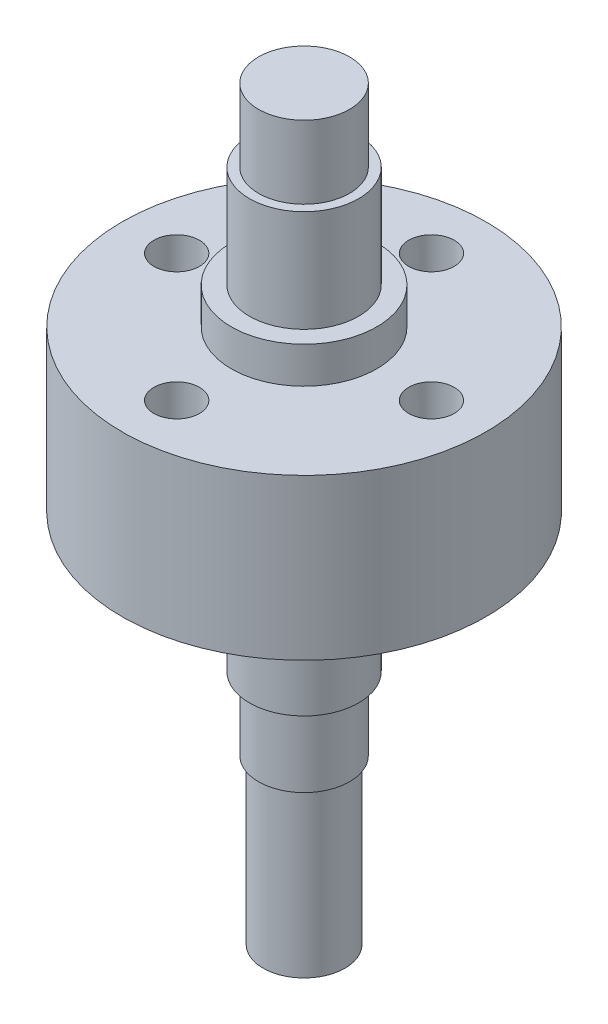
ISO-10303-21;
HEADER;
FILE_DESCRIPTION(('STEP AP214'),'2;1');
FILE_NAME('part.step','',(''),(''),'','','');
FILE_SCHEMA(('AUTOMOTIVE_DESIGN { 1 0 10303 214 1 1 1 1 }'));
ENDSEC;
DATA;
#1=APPLICATION_CONTEXT('core data for automotive mechanical design processes');
#2=APPLICATION_PROTOCOL_DEFINITION('international standard','automotive_design',2000,#1);
#3=PRODUCT_CONTEXT('',#1,'mechanical');
#4=PRODUCT('Part','Part','',(#3));
#5=PRODUCT_RELATED_PRODUCT_CATEGORY('part','',(#4));
#6=PRODUCT_DEFINITION_FORMATION('','',#4);
#7=PRODUCT_DEFINITION_CONTEXT('part definition',#1,'design');
#8=PRODUCT_DEFINITION('design','',#6,#7);
#9=PRODUCT_DEFINITION_SHAPE('','',#8);
#10=(LENGTH_UNIT() NAMED_UNIT(*) SI_UNIT(.MILLI.,.METRE.));
#11=(NAMED_UNIT(*) PLANE_ANGLE_UNIT() SI_UNIT($,.RADIAN.));
#12=(NAMED_UNIT(*) SI_UNIT($,.STERADIAN.) SOLID_ANGLE_UNIT());
#13=UNCERTAINTY_MEASURE_WITH_UNIT(LENGTH_MEASURE(1.E-05),#10,'distance_accuracy_value','');
#14=(GEOMETRIC_REPRESENTATION_CONTEXT(3) GLOBAL_UNCERTAINTY_ASSIGNED_CONTEXT((#13)) GLOBAL_UNIT_ASSIGNED_CONTEXT((#10,
#11,#12)) REPRESENTATION_CONTEXT('',''));
#15=CARTESIAN_POINT('',(0.,0.,0.));
#16=DIRECTION('',(0.,0.,1.));
#17=DIRECTION('',(1.,0.,0.));
#18=AXIS2_PLACEMENT_3D('',#15,#16,#17);
#19=CARTESIAN_POINT('',(3.99999999990086,11.6000000000056,0.));
#20=DIRECTION('',(0.,1.,0.));
#21=DIRECTION('',(-1.,0.,0.));
#22=AXIS2_PLACEMENT_3D('',#19,#20,#21);
#23=PLANE('',#22);
#24=CARTESIAN_POINT('',(-7.00000000000001,11.6000000000056,0.));
#25=DIRECTION('',(0.,-1.,0.));
#26=DIRECTION('',(0.,0.,-1.));
#27=AXIS2_PLACEMENT_3D('',#24,#25,#26);
#28=CIRCLE('',#27,1.25);
#29=CARTESIAN_POINT('',(-7.00000000000001,11.6000000000056,-1.24999999999993));
#30=VERTEX_POINT('',#29);
#31=EDGE_CURVE('E85',#30,#30,#28,.T.);
#32=ORIENTED_EDGE('',*,*,#31,.F.);
#33=EDGE_LOOP('',(#32));
#34=FACE_BOUND('',#33,.T.);
#35=CARTESIAN_POINT('',(0.,11.6000000000056,-7.));
#36=DIRECTION('',(0.,-1.,0.));
#37=DIRECTION('',(0.,0.,-1.));
#38=AXIS2_PLACEMENT_3D('',#35,#36,#37);
#39=CIRCLE('',#38,1.25);
#40=CARTESIAN_POINT('',(0.,11.6000000000056,-8.25));
#41=VERTEX_POINT('',#40);
#42=EDGE_CURVE('E93',#41,#41,#39,.T.);
#43=ORIENTED_EDGE('',*,*,#42,.F.);
#44=EDGE_LOOP('',(#43));
#45=FACE_BOUND('',#44,.T.);
#46=CARTESIAN_POINT('',(6.99999999999999,11.6000000000056,0.));
#47=DIRECTION('',(0.,-1.,0.));
#48=DIRECTION('',(0.,0.,-1.));
#49=AXIS2_PLACEMENT_3D('',#46,#47,#48);
#50=CIRCLE('',#49,1.25);
#51=CARTESIAN_POINT('',(6.99999999999999,11.6000000000056,-1.25000000000002));
#52=VERTEX_POINT('',#51);
#53=EDGE_CURVE('E101',#52,#52,#50,.T.);
#54=ORIENTED_EDGE('',*,*,#53,.F.);
#55=EDGE_LOOP('',(#54));
#56=FACE_BOUND('',#55,.T.);
#57=CARTESIAN_POINT('',(0.,11.6000000000056,7.));
#58=DIRECTION('',(0.,-1.,0.));
#59=DIRECTION('',(0.,0.,-1.));
#60=AXIS2_PLACEMENT_3D('',#57,#58,#59);
#61=CIRCLE('',#60,1.25);
#62=CARTESIAN_POINT('',(0.,11.6000000000056,5.75));
#63=VERTEX_POINT('',#62);
#64=EDGE_CURVE('E109',#63,#63,#61,.T.);
#65=ORIENTED_EDGE('',*,*,#64,.F.);
#66=EDGE_LOOP('',(#65));
#67=FACE_BOUND('',#66,.T.);
#68=CARTESIAN_POINT('',(0.,11.6000000000056,0.));
#69=DIRECTION('',(0.,1.,0.));
#70=DIRECTION('',(-1.,0.,0.));
#71=AXIS2_PLACEMENT_3D('',#68,#69,#70);
#72=CIRCLE('',#71,10.0000000000245);
#73=CARTESIAN_POINT('',(-10.0000000000246,11.6000000000056,0.));
#74=VERTEX_POINT('',#73);
#75=EDGE_CURVE('E63',#74,#74,#72,.T.);
#76=ORIENTED_EDGE('',*,*,#75,.F.);
#77=EDGE_LOOP('',(#76));
#78=FACE_BOUND('',#77,.T.);
#79=CARTESIAN_POINT('',(0.,11.6000000000056,0.));
#80=DIRECTION('',(0.,1.,0.));
#81=DIRECTION('',(-1.,0.,0.));
#82=AXIS2_PLACEMENT_3D('',#79,#80,#81);
#83=CIRCLE('',#82,3.99999999990086);
#84=CARTESIAN_POINT('',(-3.99999999990087,11.6000000000056,0.));
#85=VERTEX_POINT('',#84);
#86=EDGE_CURVE('E117',#85,#85,#83,.T.);
#87=ORIENTED_EDGE('',*,*,#86,.T.);
#88=EDGE_LOOP('',(#87));
#89=FACE_BOUND('',#88,.T.);
#90=ADVANCED_FACE('F55',(#34,#45,#56,#67,#78,#89),#23,.F.);
#91=CARTESIAN_POINT('',(0.,32.0000000000004,0.));
#92=DIRECTION('',(0.,1.,0.));
#93=DIRECTION('',(-1.,0.,0.));
#94=AXIS2_PLACEMENT_3D('',#91,#92,#93);
#95=CYLINDRICAL_SURFACE('',#94,10.0000000000246);
#96=CARTESIAN_POINT('',(0.,20.3999999999455,0.));
#97=DIRECTION('',(0.,1.,0.));
#98=DIRECTION('',(-1.,0.,0.));
#99=AXIS2_PLACEMENT_3D('',#96,#97,#98);
#100=CIRCLE('',#99,10.0000000000246);
#101=CARTESIAN_POINT('',(-10.0000000000246,20.3999999999455,0.));
#102=VERTEX_POINT('',#101);
#103=EDGE_CURVE('E165',#102,#102,#100,.T.);
#104=ORIENTED_EDGE('',*,*,#103,.F.);
#105=EDGE_LOOP('',(#104));
#106=FACE_BOUND('',#105,.T.);
#107=ORIENTED_EDGE('',*,*,#75,.T.);
#108=EDGE_LOOP('',(#107));
#109=FACE_BOUND('',#108,.T.);
#110=ADVANCED_FACE('F173',(#106,#109),#95,.T.);
#111=CARTESIAN_POINT('',(4.00000000001181,20.3999999999455,0.));
#112=DIRECTION('',(0.,-1.,0.));
#113=DIRECTION('',(1.,0.,0.));
#114=AXIS2_PLACEMENT_3D('',#111,#112,#113);
#115=PLANE('',#114);
#116=CARTESIAN_POINT('',(-7.00000000000001,20.3999999999455,0.));
#117=DIRECTION('',(0.,-1.,0.));
#118=DIRECTION('',(1.,0.,0.));
#119=AXIS2_PLACEMENT_3D('',#116,#117,#118);
#120=CIRCLE('',#119,1.25);
#121=CARTESIAN_POINT('',(-5.75000000000001,20.3999999999455,0.));
#122=VERTEX_POINT('',#121);
#123=EDGE_CURVE('E58',#122,#122,#120,.T.);
#124=ORIENTED_EDGE('',*,*,#123,.T.);
#125=EDGE_LOOP('',(#124));
#126=FACE_BOUND('',#125,.T.);
#127=CARTESIAN_POINT('',(0.,20.3999999999455,-7.));
#128=DIRECTION('',(0.,-1.,0.));
#129=DIRECTION('',(1.,0.,0.));
#130=AXIS2_PLACEMENT_3D('',#127,#128,#129);
#131=CIRCLE('',#130,1.25);
#132=CARTESIAN_POINT('',(1.24999999999999,20.3999999999455,-7.));
#133=VERTEX_POINT('',#132);
#134=EDGE_CURVE('E97',#133,#133,#131,.T.);
#135=ORIENTED_EDGE('',*,*,#134,.T.);
#136=EDGE_LOOP('',(#135));
#137=FACE_BOUND('',#136,.T.);
#138=CARTESIAN_POINT('',(6.99999999999999,20.3999999999455,0.));
#139=DIRECTION('',(0.,-1.,0.));
#140=DIRECTION('',(1.,0.,0.));
#141=AXIS2_PLACEMENT_3D('',#138,#139,#140);
#142=CIRCLE('',#141,1.25);
#143=CARTESIAN_POINT('',(8.24999999999999,20.3999999999455,0.));
#144=VERTEX_POINT('',#143);
#145=EDGE_CURVE('E105',#144,#144,#142,.T.);
#146=ORIENTED_EDGE('',*,*,#145,.T.);
#147=EDGE_LOOP('',(#146));
#148=FACE_BOUND('',#147,.T.);
#149=CARTESIAN_POINT('',(0.,20.3999999999455,7.));
#150=DIRECTION('',(0.,-1.,0.));
#151=DIRECTION('',(1.,0.,0.));
#152=AXIS2_PLACEMENT_3D('',#149,#150,#151);
#153=CIRCLE('',#152,1.25);
#154=CARTESIAN_POINT('',(1.24999999999999,20.3999999999455,7.));
#155=VERTEX_POINT('',#154);
#156=EDGE_CURVE('E113',#155,#155,#153,.T.);
#157=ORIENTED_EDGE('',*,*,#156,.T.);
#158=EDGE_LOOP('',(#157));
#159=FACE_BOUND('',#158,.T.);
#160=CARTESIAN_POINT('',(0.,20.3999999999455,0.));
#161=DIRECTION('',(0.,1.,0.));
#162=DIRECTION('',(-1.,0.,0.));
#163=AXIS2_PLACEMENT_3D('',#160,#161,#162);
#164=CIRCLE('',#163,4.00000000001182);
#165=CARTESIAN_POINT('',(-4.00000000001183,20.3999999999455,0.));
#166=VERTEX_POINT('',#165);
#167=EDGE_CURVE('E161',#166,#166,#164,.T.);
#168=ORIENTED_EDGE('',*,*,#167,.F.);
#169=EDGE_LOOP('',(#168));
#170=FACE_BOUND('',#169,.T.);
#171=ORIENTED_EDGE('',*,*,#103,.T.);
#172=EDGE_LOOP('',(#171));
#173=FACE_BOUND('',#172,.T.);
#174=ADVANCED_FACE('F242',(#126,#137,#148,#159,#170,#173),#115,.F.);
#175=CARTESIAN_POINT('',(0.,32.0000000000004,0.));
#176=DIRECTION('',(0.,1.,0.));
#177=DIRECTION('',(-1.,0.,0.));
#178=AXIS2_PLACEMENT_3D('',#175,#176,#177);
#179=CYLINDRICAL_SURFACE('',#178,4.00000000001182);
#180=CARTESIAN_POINT('',(0.,22.3999999999395,0.));
#181=DIRECTION('',(0.,1.,0.));
#182=DIRECTION('',(-1.,0.,0.));
#183=AXIS2_PLACEMENT_3D('',#180,#181,#182);
#184=CIRCLE('',#183,4.00000000001182);
#185=CARTESIAN_POINT('',(-4.00000000001183,22.3999999999395,0.));
#186=VERTEX_POINT('',#185);
#187=EDGE_CURVE('E157',#186,#186,#184,.T.);
#188=ORIENTED_EDGE('',*,*,#187,.F.);
#189=EDGE_LOOP('',(#188));
#190=FACE_BOUND('',#189,.T.);
#191=ORIENTED_EDGE('',*,*,#167,.T.);
#192=EDGE_LOOP('',(#191));
#193=FACE_BOUND('',#192,.T.);
#194=ADVANCED_FACE('F238',(#190,#193),#179,.T.);
#195=CARTESIAN_POINT('',(3.00000000000999,22.3999999999395,0.));
#196=DIRECTION('',(0.,-1.,0.));
#197=DIRECTION('',(1.,0.,0.));
#198=AXIS2_PLACEMENT_3D('',#195,#196,#197);
#199=PLANE('',#198);
#200=CARTESIAN_POINT('',(0.,22.3999999999395,0.));
#201=DIRECTION('',(0.,1.,0.));
#202=DIRECTION('',(-1.,0.,0.));
#203=AXIS2_PLACEMENT_3D('',#200,#201,#202);
#204=CIRCLE('',#203,3.00000000001);
#205=CARTESIAN_POINT('',(-3.00000000001001,22.3999999999395,0.));
#206=VERTEX_POINT('',#205);
#207=EDGE_CURVE('E153',#206,#206,#204,.T.);
#208=ORIENTED_EDGE('',*,*,#207,.F.);
#209=EDGE_LOOP('',(#208));
#210=FACE_BOUND('',#209,.T.);
#211=ORIENTED_EDGE('',*,*,#187,.T.);
#212=EDGE_LOOP('',(#211));
#213=FACE_BOUND('',#212,.T.);
#214=ADVANCED_FACE('F234',(#210,#213),#199,.F.);
#215=CARTESIAN_POINT('',(0.,32.0000000000004,0.));
#216=DIRECTION('',(0.,1.,0.));
#217=DIRECTION('',(-1.,0.,0.));
#218=AXIS2_PLACEMENT_3D('',#215,#216,#217);
#219=CYLINDRICAL_SURFACE('',#218,3.00000000001);
#220=CARTESIAN_POINT('',(0.,27.9999999999995,0.));
#221=DIRECTION('',(0.,1.,0.));
#222=DIRECTION('',(-1.,0.,0.));
#223=AXIS2_PLACEMENT_3D('',#220,#221,#222);
#224=CIRCLE('',#223,3.00000000001);
#225=CARTESIAN_POINT('',(-3.00000000001002,27.9999999999995,0.));
#226=VERTEX_POINT('',#225);
#227=EDGE_CURVE('E149',#226,#226,#224,.T.);
#228=ORIENTED_EDGE('',*,*,#227,.F.);
#229=EDGE_LOOP('',(#228));
#230=FACE_BOUND('',#229,.T.);
#231=ORIENTED_EDGE('',*,*,#207,.T.);
#232=EDGE_LOOP('',(#231));
#233=FACE_BOUND('',#232,.T.);
#234=ADVANCED_FACE('F230',(#230,#233),#219,.T.);
#235=CARTESIAN_POINT('',(2.50000000000272,27.9999999999995,0.));
#236=DIRECTION('',(0.,-1.,0.));
#237=DIRECTION('',(1.,0.,0.));
#238=AXIS2_PLACEMENT_3D('',#235,#236,#237);
#239=PLANE('',#238);
#240=CARTESIAN_POINT('',(0.,27.9999999999995,0.));
#241=DIRECTION('',(0.,1.,0.));
#242=DIRECTION('',(-1.,0.,0.));
#243=AXIS2_PLACEMENT_3D('',#240,#241,#242);
#244=CIRCLE('',#243,2.50000000000273);
#245=CARTESIAN_POINT('',(-2.50000000000274,27.9999999999995,0.));
#246=VERTEX_POINT('',#245);
#247=EDGE_CURVE('E145',#246,#246,#244,.T.);
#248=ORIENTED_EDGE('',*,*,#247,.F.);
#249=EDGE_LOOP('',(#248));
#250=FACE_BOUND('',#249,.T.);
#251=ORIENTED_EDGE('',*,*,#227,.T.);
#252=EDGE_LOOP('',(#251));
#253=FACE_BOUND('',#252,.T.);
#254=ADVANCED_FACE('F226',(#250,#253),#239,.F.);
#255=CARTESIAN_POINT('',(0.,32.0000000000004,0.));
#256=DIRECTION('',(0.,1.,0.));
#257=DIRECTION('',(-1.,0.,0.));
#258=AXIS2_PLACEMENT_3D('',#255,#256,#257);
#259=CYLINDRICAL_SURFACE('',#258,2.50000000000273);
#260=CARTESIAN_POINT('',(0.,32.0000000000004,0.));
#261=DIRECTION('',(0.,1.,0.));
#262=DIRECTION('',(-1.,0.,0.));
#263=AXIS2_PLACEMENT_3D('',#260,#261,#262);
#264=CIRCLE('',#263,2.50000000000273);
#265=CARTESIAN_POINT('',(-2.50000000000274,32.0000000000004,0.));
#266=VERTEX_POINT('',#265);
#267=EDGE_CURVE('E141',#266,#266,#264,.T.);
#268=ORIENTED_EDGE('',*,*,#267,.F.);
#269=EDGE_LOOP('',(#268));
#270=FACE_BOUND('',#269,.T.);
#271=ORIENTED_EDGE('',*,*,#247,.T.);
#272=EDGE_LOOP('',(#271));
#273=FACE_BOUND('',#272,.T.);
#274=ADVANCED_FACE('F219',(#270,#273),#259,.T.);
#275=CARTESIAN_POINT('',(0.,32.0000000000004,0.));
#276=DIRECTION('',(0.,-1.,0.));
#277=DIRECTION('',(1.,0.,0.));
#278=AXIS2_PLACEMENT_3D('',#275,#276,#277);
#279=PLANE('',#278);
#280=ORIENTED_EDGE('',*,*,#267,.T.);
#281=EDGE_LOOP('',(#280));
#282=FACE_BOUND('',#281,.T.);
#283=ADVANCED_FACE('F213',(#282),#279,.F.);
#284=CARTESIAN_POINT('',(0.,0.,0.));
#285=DIRECTION('',(0.,1.,0.));
#286=DIRECTION('',(-1.,0.,0.));
#287=AXIS2_PLACEMENT_3D('',#284,#285,#286);
#288=PLANE('',#287);
#289=CARTESIAN_POINT('',(0.,0.,0.));
#290=DIRECTION('',(0.,-1.,0.));
#291=DIRECTION('',(1.,0.,0.));
#292=AXIS2_PLACEMENT_3D('',#289,#290,#291);
#293=CIRCLE('',#292,2.25);
#294=CARTESIAN_POINT('',(2.25,0.,0.));
#295=VERTEX_POINT('',#294);
#296=EDGE_CURVE('E11',#295,#295,#293,.T.);
#297=ORIENTED_EDGE('',*,*,#296,.F.);
#298=EDGE_LOOP('',(#297));
#299=FACE_BOUND('',#298,.T.);
#300=CARTESIAN_POINT('',(0.,0.,0.));
#301=DIRECTION('',(0.,1.,0.));
#302=DIRECTION('',(-1.,0.,0.));
#303=AXIS2_PLACEMENT_3D('',#300,#301,#302);
#304=CIRCLE('',#303,2.50000000003182);
#305=CARTESIAN_POINT('',(-2.50000000003182,0.,0.));
#306=VERTEX_POINT('',#305);
#307=EDGE_CURVE('E137',#306,#306,#304,.T.);
#308=ORIENTED_EDGE('',*,*,#307,.F.);
#309=EDGE_LOOP('',(#308));
#310=FACE_BOUND('',#309,.T.);
#311=ADVANCED_FACE('F208',(#299,#310),#288,.F.);
#312=CARTESIAN_POINT('',(0.,32.0000000000004,0.));
#313=DIRECTION('',(0.,1.,0.));
#314=DIRECTION('',(-1.,0.,0.));
#315=AXIS2_PLACEMENT_3D('',#312,#313,#314);
#316=CYLINDRICAL_SURFACE('',#315,2.50000000003182);
#317=CARTESIAN_POINT('',(0.,4.,0.));
#318=DIRECTION('',(0.,1.,0.));
#319=DIRECTION('',(-1.,0.,0.));
#320=AXIS2_PLACEMENT_3D('',#317,#318,#319);
#321=CIRCLE('',#320,2.50000000003182);
#322=CARTESIAN_POINT('',(-2.50000000003183,4.,0.));
#323=VERTEX_POINT('',#322);
#324=EDGE_CURVE('E133',#323,#323,#321,.T.);
#325=ORIENTED_EDGE('',*,*,#324,.F.);
#326=EDGE_LOOP('',(#325));
#327=FACE_BOUND('',#326,.T.);
#328=ORIENTED_EDGE('',*,*,#307,.T.);
#329=EDGE_LOOP('',(#328));
#330=FACE_BOUND('',#329,.T.);
#331=ADVANCED_FACE('F202',(#327,#330),#316,.T.);
#332=CARTESIAN_POINT('',(2.50000000003182,4.,0.));
#333=DIRECTION('',(0.,1.,0.));
#334=DIRECTION('',(-1.,0.,0.));
#335=AXIS2_PLACEMENT_3D('',#332,#333,#334);
#336=PLANE('',#335);
#337=CARTESIAN_POINT('',(0.,4.,0.));
#338=DIRECTION('',(0.,1.,0.));
#339=DIRECTION('',(-1.,0.,0.));
#340=AXIS2_PLACEMENT_3D('',#337,#338,#339);
#341=CIRCLE('',#340,3.00000000002455);
#342=CARTESIAN_POINT('',(-3.00000000002455,3.99999999999999,0.));
#343=VERTEX_POINT('',#342);
#344=EDGE_CURVE('E129',#343,#343,#341,.T.);
#345=ORIENTED_EDGE('',*,*,#344,.F.);
#346=EDGE_LOOP('',(#345));
#347=FACE_BOUND('',#346,.T.);
#348=ORIENTED_EDGE('',*,*,#324,.T.);
#349=EDGE_LOOP('',(#348));
#350=FACE_BOUND('',#349,.T.);
#351=ADVANCED_FACE('F196',(#347,#350),#336,.F.);
#352=CARTESIAN_POINT('',(0.,32.0000000000004,0.));
#353=DIRECTION('',(0.,1.,0.));
#354=DIRECTION('',(-1.,0.,0.));
#355=AXIS2_PLACEMENT_3D('',#352,#353,#354);
#356=CYLINDRICAL_SURFACE('',#355,3.00000000002455);
#357=CARTESIAN_POINT('',(0.,9.60000000001014,0.));
#358=DIRECTION('',(0.,1.,0.));
#359=DIRECTION('',(-1.,0.,0.));
#360=AXIS2_PLACEMENT_3D('',#357,#358,#359);
#361=CIRCLE('',#360,3.00000000002456);
#362=CARTESIAN_POINT('',(-3.00000000002456,9.60000000001014,0.));
#363=VERTEX_POINT('',#362);
#364=EDGE_CURVE('E125',#363,#363,#361,.T.);
#365=ORIENTED_EDGE('',*,*,#364,.F.);
#366=EDGE_LOOP('',(#365));
#367=FACE_BOUND('',#366,.T.);
#368=ORIENTED_EDGE('',*,*,#344,.T.);
#369=EDGE_LOOP('',(#368));
#370=FACE_BOUND('',#369,.T.);
#371=ADVANCED_FACE('F190',(#367,#370),#356,.T.);
#372=CARTESIAN_POINT('',(3.00000000002455,9.60000000001014,0.));
#373=DIRECTION('',(0.,1.,0.));
#374=DIRECTION('',(-1.,0.,0.));
#375=AXIS2_PLACEMENT_3D('',#372,#373,#374);
#376=PLANE('',#375);
#377=CARTESIAN_POINT('',(0.,9.60000000001014,0.));
#378=DIRECTION('',(0.,1.,0.));
#379=DIRECTION('',(-1.,0.,0.));
#380=AXIS2_PLACEMENT_3D('',#377,#378,#379);
#381=CIRCLE('',#380,3.99999999990086);
#382=CARTESIAN_POINT('',(-3.99999999990087,9.60000000001013,0.));
#383=VERTEX_POINT('',#382);
#384=EDGE_CURVE('E121',#383,#383,#381,.T.);
#385=ORIENTED_EDGE('',*,*,#384,.F.);
#386=EDGE_LOOP('',(#385));
#387=FACE_BOUND('',#386,.T.);
#388=ORIENTED_EDGE('',*,*,#364,.T.);
#389=EDGE_LOOP('',(#388));
#390=FACE_BOUND('',#389,.T.);
#391=ADVANCED_FACE('F184',(#387,#390),#376,.F.);
#392=CARTESIAN_POINT('',(0.,32.0000000000004,0.));
#393=DIRECTION('',(0.,1.,0.));
#394=DIRECTION('',(-1.,0.,0.));
#395=AXIS2_PLACEMENT_3D('',#392,#393,#394);
#396=CYLINDRICAL_SURFACE('',#395,3.99999999990086);
#397=ORIENTED_EDGE('',*,*,#86,.F.);
#398=EDGE_LOOP('',(#397));
#399=FACE_BOUND('',#398,.T.);
#400=ORIENTED_EDGE('',*,*,#384,.T.);
#401=EDGE_LOOP('',(#400));
#402=FACE_BOUND('',#401,.T.);
#403=ADVANCED_FACE('F180',(#399,#402),#396,.T.);
#404=CARTESIAN_POINT('',(0.,11.6000000000056,7.));
#405=DIRECTION('',(0.,-1.,0.));
#406=DIRECTION('',(0.,0.,-1.));
#407=AXIS2_PLACEMENT_3D('',#404,#405,#406);
#408=CYLINDRICAL_SURFACE('',#407,1.25);
#409=ORIENTED_EDGE('',*,*,#64,.T.);
#410=EDGE_LOOP('',(#409));
#411=FACE_BOUND('',#410,.T.);
#412=ORIENTED_EDGE('',*,*,#156,.F.);
#413=EDGE_LOOP('',(#412));
#414=FACE_BOUND('',#413,.T.);
#415=ADVANCED_FACE('F183',(#411,#414),#408,.F.);
#416=CARTESIAN_POINT('',(6.99999999999999,11.6000000000056,0.));
#417=DIRECTION('',(0.,-1.,0.));
#418=DIRECTION('',(0.,0.,-1.));
#419=AXIS2_PLACEMENT_3D('',#416,#417,#418);
#420=CYLINDRICAL_SURFACE('',#419,1.25);
#421=ORIENTED_EDGE('',*,*,#53,.T.);
#422=EDGE_LOOP('',(#421));
#423=FACE_BOUND('',#422,.T.);
#424=ORIENTED_EDGE('',*,*,#145,.F.);
#425=EDGE_LOOP('',(#424));
#426=FACE_BOUND('',#425,.T.);
#427=ADVANCED_FACE('F314',(#423,#426),#420,.F.);
#428=CARTESIAN_POINT('',(0.,11.6000000000056,-7.));
#429=DIRECTION('',(0.,-1.,0.));
#430=DIRECTION('',(0.,0.,-1.));
#431=AXIS2_PLACEMENT_3D('',#428,#429,#430);
#432=CYLINDRICAL_SURFACE('',#431,1.25);
#433=ORIENTED_EDGE('',*,*,#42,.T.);
#434=EDGE_LOOP('',(#433));
#435=FACE_BOUND('',#434,.T.);
#436=ORIENTED_EDGE('',*,*,#134,.F.);
#437=EDGE_LOOP('',(#436));
#438=FACE_BOUND('',#437,.T.);
#439=ADVANCED_FACE('F322',(#435,#438),#432,.F.);
#440=CARTESIAN_POINT('',(-7.00000000000001,11.6000000000056,0.));
#441=DIRECTION('',(0.,-1.,0.));
#442=DIRECTION('',(0.,0.,-1.));
#443=AXIS2_PLACEMENT_3D('',#440,#441,#442);
#444=CYLINDRICAL_SURFACE('',#443,1.25);
#445=ORIENTED_EDGE('',*,*,#31,.T.);
#446=EDGE_LOOP('',(#445));
#447=FACE_BOUND('',#446,.T.);
#448=ORIENTED_EDGE('',*,*,#123,.F.);
#449=EDGE_LOOP('',(#448));
#450=FACE_BOUND('',#449,.T.);
#451=ADVANCED_FACE('F331',(#447,#450),#444,.F.);
#452=CARTESIAN_POINT('',(0.,-9.,0.));
#453=DIRECTION('',(0.,1.,0.));
#454=DIRECTION('',(-1.,0.,0.));
#455=AXIS2_PLACEMENT_3D('',#452,#453,#454);
#456=CYLINDRICAL_SURFACE('',#455,2.25);
#457=CARTESIAN_POINT('',(0.,-9.,0.));
#458=DIRECTION('',(0.,-1.,0.));
#459=DIRECTION('',(1.,0.,0.));
#460=AXIS2_PLACEMENT_3D('',#457,#458,#459);
#461=CIRCLE('',#460,2.25);
#462=CARTESIAN_POINT('',(2.25,-9.,0.));
#463=VERTEX_POINT('',#462);
#464=EDGE_CURVE('E78',#463,#463,#461,.T.);
#465=ORIENTED_EDGE('',*,*,#464,.F.);
#466=EDGE_LOOP('',(#465));
#467=FACE_BOUND('',#466,.T.);
#468=ORIENTED_EDGE('',*,*,#296,.T.);
#469=EDGE_LOOP('',(#468));
#470=FACE_BOUND('',#469,.T.);
#471=ADVANCED_FACE('F340',(#467,#470),#456,.T.);
#472=CARTESIAN_POINT('',(0.,-9.,0.));
#473=DIRECTION('',(0.,-1.,0.));
#474=DIRECTION('',(1.,0.,0.));
#475=AXIS2_PLACEMENT_3D('',#472,#473,#474);
#476=PLANE('',#475);
#477=CARTESIAN_POINT('',(0.,-9.,0.));
#478=DIRECTION('',(0.,-1.,0.));
#479=DIRECTION('',(0.,0.,-1.));
#480=AXIS2_PLACEMENT_3D('',#477,#478,#479);
#481=CIRCLE('',#480,1.24999999999999);
#482=CARTESIAN_POINT('',(0.,-9.,-1.24999999999999));
#483=VERTEX_POINT('',#482);
#484=EDGE_CURVE('E79',#483,#483,#481,.T.);
#485=ORIENTED_EDGE('',*,*,#484,.F.);
#486=EDGE_LOOP('',(#485));
#487=FACE_BOUND('',#486,.T.);
#488=ORIENTED_EDGE('',*,*,#464,.T.);
#489=EDGE_LOOP('',(#488));
#490=FACE_BOUND('',#489,.T.);
#491=ADVANCED_FACE('F71',(#487,#490),#476,.T.);
#492=CARTESIAN_POINT('',(0.,3.,0.));
#493=DIRECTION('',(0.,-1.,0.));
#494=DIRECTION('',(0.,0.,-1.));
#495=AXIS2_PLACEMENT_3D('',#492,#493,#494);
#496=CONICAL_SURFACE('',#495,1.25,1.02974425867665);
#497=CARTESIAN_POINT('',(0.,3.75107577378445,0.));
#498=VERTEX_POINT('',#497);
#499=VERTEX_LOOP('',#498);
#500=FACE_BOUND('',#499,.T.);
#501=CARTESIAN_POINT('',(0.,3.,0.));
#502=DIRECTION('',(0.,-1.,0.));
#503=DIRECTION('',(0.,0.,-1.));
#504=AXIS2_PLACEMENT_3D('',#501,#502,#503);
#505=CIRCLE('',#504,1.25);
#506=CARTESIAN_POINT('',(0.,3.,-1.25));
#507=VERTEX_POINT('',#506);
#508=EDGE_CURVE('E75',#507,#507,#505,.T.);
#509=ORIENTED_EDGE('',*,*,#508,.T.);
#510=EDGE_LOOP('',(#509));
#511=FACE_BOUND('',#510,.T.);
#512=ADVANCED_FACE('F67',(#500,#511),#496,.F.);
#513=CARTESIAN_POINT('',(0.,-9.,0.));
#514=DIRECTION('',(0.,-1.,0.));
#515=DIRECTION('',(0.,0.,-1.));
#516=AXIS2_PLACEMENT_3D('',#513,#514,#515);
#517=CYLINDRICAL_SURFACE('',#516,1.24999999999999);
#518=ORIENTED_EDGE('',*,*,#508,.F.);
#519=EDGE_LOOP('',(#518));
#520=FACE_BOUND('',#519,.T.);
#521=ORIENTED_EDGE('',*,*,#484,.T.);
#522=EDGE_LOOP('',(#521));
#523=FACE_BOUND('',#522,.T.);
#524=ADVANCED_FACE('F70',(#520,#523),#517,.F.);
#525=CLOSED_SHELL('',(#90,#110,#174,#194,#214,#234,#254,#274,#283,#311,#331,#351,#371,#391,#403,
#415,#427,#439,#451,#471,#491,#512,#524));
#526=MANIFOLD_SOLID_BREP('B2',#525);
#527=ADVANCED_BREP_SHAPE_REPRESENTATION('',(#18,#526),#14);
#528=SHAPE_DEFINITION_REPRESENTATION(#9,#527);
ENDSEC;
END-ISO-10303-21;
